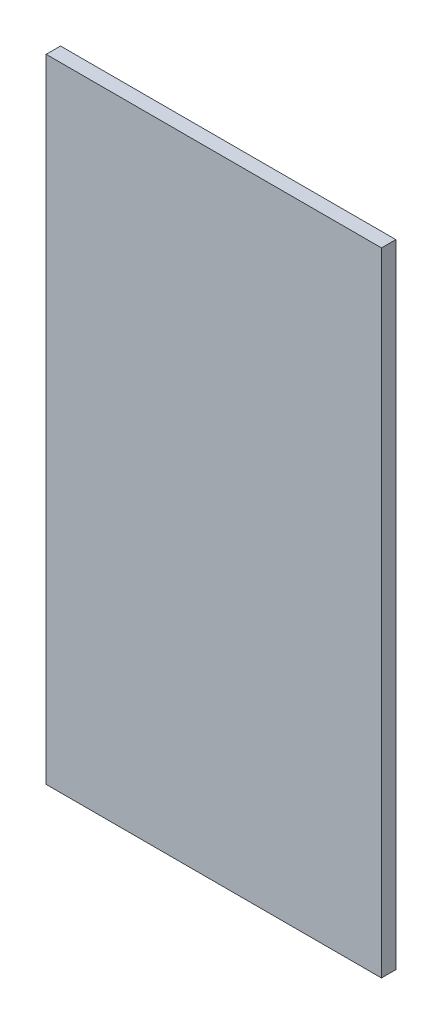
ISO-10303-21;
HEADER;
FILE_DESCRIPTION(('STEP AP214'),'2;1');
FILE_NAME('part.step','',(''),(''),'','','');
FILE_SCHEMA(('AUTOMOTIVE_DESIGN { 1 0 10303 214 1 1 1 1 }'));
ENDSEC;
DATA;
#1=APPLICATION_CONTEXT('core data for automotive mechanical design processes');
#2=APPLICATION_PROTOCOL_DEFINITION('international standard','automotive_design',2000,#1);
#3=PRODUCT_CONTEXT('',#1,'mechanical');
#4=PRODUCT('Part','Part','',(#3));
#5=PRODUCT_RELATED_PRODUCT_CATEGORY('part','',(#4));
#6=PRODUCT_DEFINITION_FORMATION('','',#4);
#7=PRODUCT_DEFINITION_CONTEXT('part definition',#1,'design');
#8=PRODUCT_DEFINITION('design','',#6,#7);
#9=PRODUCT_DEFINITION_SHAPE('','',#8);
#10=(LENGTH_UNIT() NAMED_UNIT(*) SI_UNIT(.MILLI.,.METRE.));
#11=(NAMED_UNIT(*) PLANE_ANGLE_UNIT() SI_UNIT($,.RADIAN.));
#12=(NAMED_UNIT(*) SI_UNIT($,.STERADIAN.) SOLID_ANGLE_UNIT());
#13=UNCERTAINTY_MEASURE_WITH_UNIT(LENGTH_MEASURE(1.E-05),#10,'distance_accuracy_value','');
#14=(GEOMETRIC_REPRESENTATION_CONTEXT(3) GLOBAL_UNCERTAINTY_ASSIGNED_CONTEXT((#13)) GLOBAL_UNIT_ASSIGNED_CONTEXT((#10,
#11,#12)) REPRESENTATION_CONTEXT('',''));
#15=CARTESIAN_POINT('',(0.,0.,0.));
#16=DIRECTION('',(0.,0.,1.));
#17=DIRECTION('',(1.,0.,0.));
#18=AXIS2_PLACEMENT_3D('',#15,#16,#17);
#19=CARTESIAN_POINT('',(0.,0.,18.));
#20=DIRECTION('',(1.,0.,0.));
#21=DIRECTION('',(0.,0.,-1.));
#22=AXIS2_PLACEMENT_3D('',#19,#20,#21);
#23=PLANE('',#22);
#24=DIRECTION('',(0.,-1.,0.));
#25=VECTOR('',#24,1.);
#26=CARTESIAN_POINT('',(0.,0.,0.));
#27=LINE('',#26,#25);
#28=CARTESIAN_POINT('',(0.,792.,0.));
#29=VERTEX_POINT('',#28);
#30=CARTESIAN_POINT('',(0.,0.,0.));
#31=VERTEX_POINT('',#30);
#32=EDGE_CURVE('E95',#29,#31,#27,.T.);
#33=ORIENTED_EDGE('',*,*,#32,.T.);
#34=DIRECTION('',(0.,0.,-1.));
#35=VECTOR('',#34,1.);
#36=CARTESIAN_POINT('',(0.,0.,18.));
#37=LINE('',#36,#35);
#38=CARTESIAN_POINT('',(0.,0.,18.));
#39=VERTEX_POINT('',#38);
#40=EDGE_CURVE('E11',#39,#31,#37,.T.);
#41=ORIENTED_EDGE('',*,*,#40,.F.);
#42=DIRECTION('',(0.,-1.,0.));
#43=VECTOR('',#42,1.);
#44=CARTESIAN_POINT('',(0.,0.,18.));
#45=LINE('',#44,#43);
#46=CARTESIAN_POINT('',(0.,792.,18.));
#47=VERTEX_POINT('',#46);
#48=EDGE_CURVE('E83',#47,#39,#45,.T.);
#49=ORIENTED_EDGE('',*,*,#48,.F.);
#50=DIRECTION('',(0.,0.,-1.));
#51=VECTOR('',#50,1.);
#52=CARTESIAN_POINT('',(0.,792.,18.));
#53=LINE('',#52,#51);
#54=EDGE_CURVE('E91',#47,#29,#53,.T.);
#55=ORIENTED_EDGE('',*,*,#54,.T.);
#56=EDGE_LOOP('',(#33,#41,#49,#55));
#57=FACE_BOUND('',#56,.T.);
#58=ADVANCED_FACE('F32',(#57),#23,.F.);
#59=CARTESIAN_POINT('',(0.,0.,18.));
#60=DIRECTION('',(0.,1.,0.));
#61=DIRECTION('',(0.,0.,1.));
#62=AXIS2_PLACEMENT_3D('',#59,#60,#61);
#63=PLANE('',#62);
#64=DIRECTION('',(1.,0.,0.));
#65=VECTOR('',#64,1.);
#66=CARTESIAN_POINT('',(0.,0.,0.));
#67=LINE('',#66,#65);
#68=CARTESIAN_POINT('',(420.,0.,0.));
#69=VERTEX_POINT('',#68);
#70=EDGE_CURVE('E87',#31,#69,#67,.T.);
#71=ORIENTED_EDGE('',*,*,#70,.T.);
#72=DIRECTION('',(0.,0.,-1.));
#73=VECTOR('',#72,1.);
#74=CARTESIAN_POINT('',(420.,0.,18.));
#75=LINE('',#74,#73);
#76=CARTESIAN_POINT('',(420.,0.,18.));
#77=VERTEX_POINT('',#76);
#78=EDGE_CURVE('E40',#77,#69,#75,.T.);
#79=ORIENTED_EDGE('',*,*,#78,.F.);
#80=DIRECTION('',(1.,0.,0.));
#81=VECTOR('',#80,1.);
#82=CARTESIAN_POINT('',(0.,0.,18.));
#83=LINE('',#82,#81);
#84=EDGE_CURVE('E78',#39,#77,#83,.T.);
#85=ORIENTED_EDGE('',*,*,#84,.F.);
#86=ORIENTED_EDGE('',*,*,#40,.T.);
#87=EDGE_LOOP('',(#71,#79,#85,#86));
#88=FACE_BOUND('',#87,.T.);
#89=ADVANCED_FACE('F86',(#88),#63,.F.);
#90=CARTESIAN_POINT('',(420.,0.,18.));
#91=DIRECTION('',(-1.,0.,0.));
#92=DIRECTION('',(0.,0.,1.));
#93=AXIS2_PLACEMENT_3D('',#90,#91,#92);
#94=PLANE('',#93);
#95=DIRECTION('',(0.,1.,0.));
#96=VECTOR('',#95,1.);
#97=CARTESIAN_POINT('',(420.,0.,0.));
#98=LINE('',#97,#96);
#99=CARTESIAN_POINT('',(420.,792.,0.));
#100=VERTEX_POINT('',#99);
#101=EDGE_CURVE('E65',#69,#100,#98,.T.);
#102=ORIENTED_EDGE('',*,*,#101,.T.);
#103=DIRECTION('',(0.,0.,-1.));
#104=VECTOR('',#103,1.);
#105=CARTESIAN_POINT('',(420.,792.,18.));
#106=LINE('',#105,#104);
#107=CARTESIAN_POINT('',(420.,792.,18.));
#108=VERTEX_POINT('',#107);
#109=EDGE_CURVE('E88',#108,#100,#106,.T.);
#110=ORIENTED_EDGE('',*,*,#109,.F.);
#111=DIRECTION('',(0.,1.,0.));
#112=VECTOR('',#111,1.);
#113=CARTESIAN_POINT('',(420.,0.,18.));
#114=LINE('',#113,#112);
#115=EDGE_CURVE('E81',#77,#108,#114,.T.);
#116=ORIENTED_EDGE('',*,*,#115,.F.);
#117=ORIENTED_EDGE('',*,*,#78,.T.);
#118=EDGE_LOOP('',(#102,#110,#116,#117));
#119=FACE_BOUND('',#118,.T.);
#120=ADVANCED_FACE('F89',(#119),#94,.F.);
#121=CARTESIAN_POINT('',(0.,792.,18.));
#122=DIRECTION('',(0.,-1.,0.));
#123=DIRECTION('',(0.,0.,-1.));
#124=AXIS2_PLACEMENT_3D('',#121,#122,#123);
#125=PLANE('',#124);
#126=DIRECTION('',(-1.,0.,0.));
#127=VECTOR('',#126,1.);
#128=CARTESIAN_POINT('',(0.,792.,0.));
#129=LINE('',#128,#127);
#130=EDGE_CURVE('E71',#100,#29,#129,.T.);
#131=ORIENTED_EDGE('',*,*,#130,.T.);
#132=ORIENTED_EDGE('',*,*,#54,.F.);
#133=DIRECTION('',(-1.,0.,0.));
#134=VECTOR('',#133,1.);
#135=CARTESIAN_POINT('',(0.,792.,18.));
#136=LINE('',#135,#134);
#137=EDGE_CURVE('E48',#108,#47,#136,.T.);
#138=ORIENTED_EDGE('',*,*,#137,.F.);
#139=ORIENTED_EDGE('',*,*,#109,.T.);
#140=EDGE_LOOP('',(#131,#132,#138,#139));
#141=FACE_BOUND('',#140,.T.);
#142=ADVANCED_FACE('F102',(#141),#125,.F.);
#143=CARTESIAN_POINT('',(0.,0.,18.));
#144=DIRECTION('',(0.,0.,-1.));
#145=DIRECTION('',(-1.,0.,0.));
#146=AXIS2_PLACEMENT_3D('',#143,#144,#145);
#147=PLANE('',#146);
#148=ORIENTED_EDGE('',*,*,#48,.T.);
#149=ORIENTED_EDGE('',*,*,#84,.T.);
#150=ORIENTED_EDGE('',*,*,#115,.T.);
#151=ORIENTED_EDGE('',*,*,#137,.T.);
#152=EDGE_LOOP('',(#148,#149,#150,#151));
#153=FACE_BOUND('',#152,.T.);
#154=ADVANCED_FACE('F79',(#153),#147,.F.);
#155=CARTESIAN_POINT('',(0.,0.,0.));
#156=DIRECTION('',(0.,0.,-1.));
#157=DIRECTION('',(-1.,0.,0.));
#158=AXIS2_PLACEMENT_3D('',#155,#156,#157);
#159=PLANE('',#158);
#160=ORIENTED_EDGE('',*,*,#32,.F.);
#161=ORIENTED_EDGE('',*,*,#130,.F.);
#162=ORIENTED_EDGE('',*,*,#101,.F.);
#163=ORIENTED_EDGE('',*,*,#70,.F.);
#164=EDGE_LOOP('',(#160,#161,#162,#163));
#165=FACE_BOUND('',#164,.T.);
#166=ADVANCED_FACE('F105',(#165),#159,.T.);
#167=CLOSED_SHELL('',(#58,#89,#120,#142,#154,#166));
#168=MANIFOLD_SOLID_BREP('B2',#167);
#169=ADVANCED_BREP_SHAPE_REPRESENTATION('',(#18,#168),#14);
#170=SHAPE_DEFINITION_REPRESENTATION(#9,#169);
ENDSEC;
END-ISO-10303-21;
